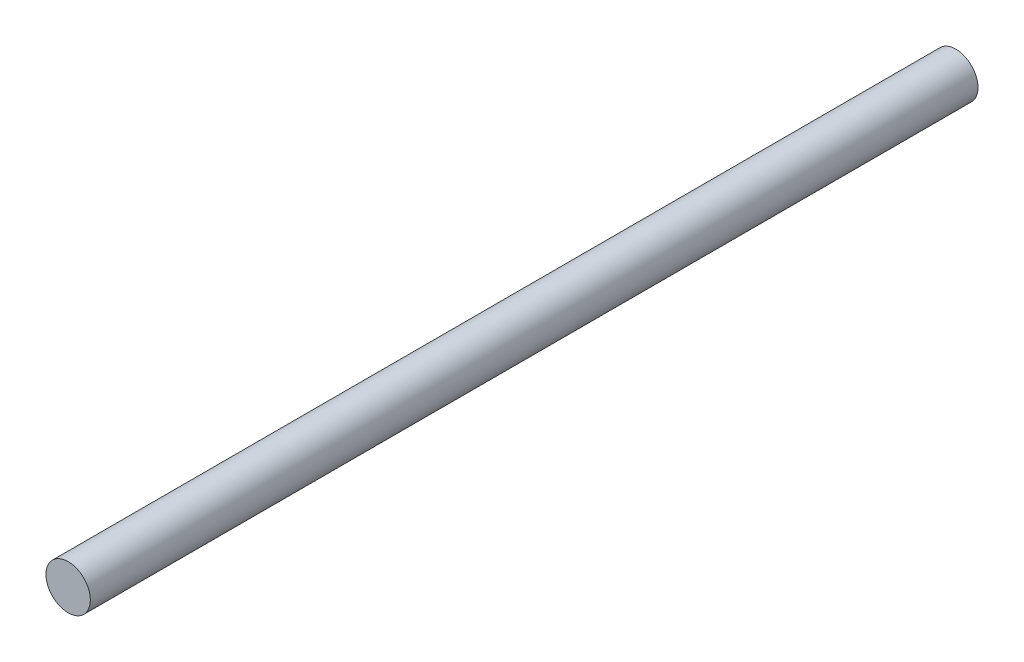
ISO-10303-21;
HEADER;
FILE_DESCRIPTION(('STEP AP214'),'2;1');
FILE_NAME('part.step','',(''),(''),'','','');
FILE_SCHEMA(('AUTOMOTIVE_DESIGN { 1 0 10303 214 1 1 1 1 }'));
ENDSEC;
DATA;
#1=APPLICATION_CONTEXT('core data for automotive mechanical design processes');
#2=APPLICATION_PROTOCOL_DEFINITION('international standard','automotive_design',2000,#1);
#3=PRODUCT_CONTEXT('',#1,'mechanical');
#4=PRODUCT('Part','Part','',(#3));
#5=PRODUCT_RELATED_PRODUCT_CATEGORY('part','',(#4));
#6=PRODUCT_DEFINITION_FORMATION('','',#4);
#7=PRODUCT_DEFINITION_CONTEXT('part definition',#1,'design');
#8=PRODUCT_DEFINITION('design','',#6,#7);
#9=PRODUCT_DEFINITION_SHAPE('','',#8);
#10=(LENGTH_UNIT() NAMED_UNIT(*) SI_UNIT(.MILLI.,.METRE.));
#11=(NAMED_UNIT(*) PLANE_ANGLE_UNIT() SI_UNIT($,.RADIAN.));
#12=(NAMED_UNIT(*) SI_UNIT($,.STERADIAN.) SOLID_ANGLE_UNIT());
#13=UNCERTAINTY_MEASURE_WITH_UNIT(LENGTH_MEASURE(1.E-05),#10,'distance_accuracy_value','');
#14=(GEOMETRIC_REPRESENTATION_CONTEXT(3) GLOBAL_UNCERTAINTY_ASSIGNED_CONTEXT((#13)) GLOBAL_UNIT_ASSIGNED_CONTEXT((#10,
#11,#12)) REPRESENTATION_CONTEXT('',''));
#15=CARTESIAN_POINT('',(0.,0.,0.));
#16=DIRECTION('',(0.,0.,1.));
#17=DIRECTION('',(1.,0.,0.));
#18=AXIS2_PLACEMENT_3D('',#15,#16,#17);
#19=CARTESIAN_POINT('',(0.,0.,-127.));
#20=DIRECTION('',(0.,0.,1.));
#21=DIRECTION('',(1.,0.,0.));
#22=AXIS2_PLACEMENT_3D('',#19,#20,#21);
#23=CYLINDRICAL_SURFACE('',#22,6.35);
#24=CARTESIAN_POINT('',(0.,0.,-127.));
#25=DIRECTION('',(0.,0.,1.));
#26=DIRECTION('',(1.,0.,0.));
#27=AXIS2_PLACEMENT_3D('',#24,#25,#26);
#28=CIRCLE('',#27,6.35);
#29=CARTESIAN_POINT('',(6.35,0.,-127.));
#30=VERTEX_POINT('',#29);
#31=EDGE_CURVE('E10',#30,#30,#28,.T.);
#32=ORIENTED_EDGE('',*,*,#31,.T.);
#33=EDGE_LOOP('',(#32));
#34=FACE_BOUND('',#33,.T.);
#35=CARTESIAN_POINT('',(0.,0.,127.));
#36=DIRECTION('',(0.,0.,1.));
#37=DIRECTION('',(1.,0.,0.));
#38=AXIS2_PLACEMENT_3D('',#35,#36,#37);
#39=CIRCLE('',#38,6.35);
#40=CARTESIAN_POINT('',(6.35,0.,127.));
#41=VERTEX_POINT('',#40);
#42=EDGE_CURVE('E38',#41,#41,#39,.T.);
#43=ORIENTED_EDGE('',*,*,#42,.F.);
#44=EDGE_LOOP('',(#43));
#45=FACE_BOUND('',#44,.T.);
#46=ADVANCED_FACE('F32',(#34,#45),#23,.T.);
#47=CARTESIAN_POINT('',(0.,0.,-127.));
#48=DIRECTION('',(0.,0.,1.));
#49=DIRECTION('',(1.,0.,0.));
#50=AXIS2_PLACEMENT_3D('',#47,#48,#49);
#51=PLANE('',#50);
#52=ORIENTED_EDGE('',*,*,#31,.F.);
#53=EDGE_LOOP('',(#52));
#54=FACE_BOUND('',#53,.T.);
#55=ADVANCED_FACE('F47',(#54),#51,.F.);
#56=CARTESIAN_POINT('',(0.,0.,127.));
#57=DIRECTION('',(0.,0.,1.));
#58=DIRECTION('',(1.,0.,0.));
#59=AXIS2_PLACEMENT_3D('',#56,#57,#58);
#60=PLANE('',#59);
#61=ORIENTED_EDGE('',*,*,#42,.T.);
#62=EDGE_LOOP('',(#61));
#63=FACE_BOUND('',#62,.T.);
#64=ADVANCED_FACE('F44',(#63),#60,.T.);
#65=CLOSED_SHELL('',(#46,#55,#64));
#66=MANIFOLD_SOLID_BREP('B2',#65);
#67=ADVANCED_BREP_SHAPE_REPRESENTATION('',(#18,#66),#14);
#68=SHAPE_DEFINITION_REPRESENTATION(#9,#67);
ENDSEC;
END-ISO-10303-21;
